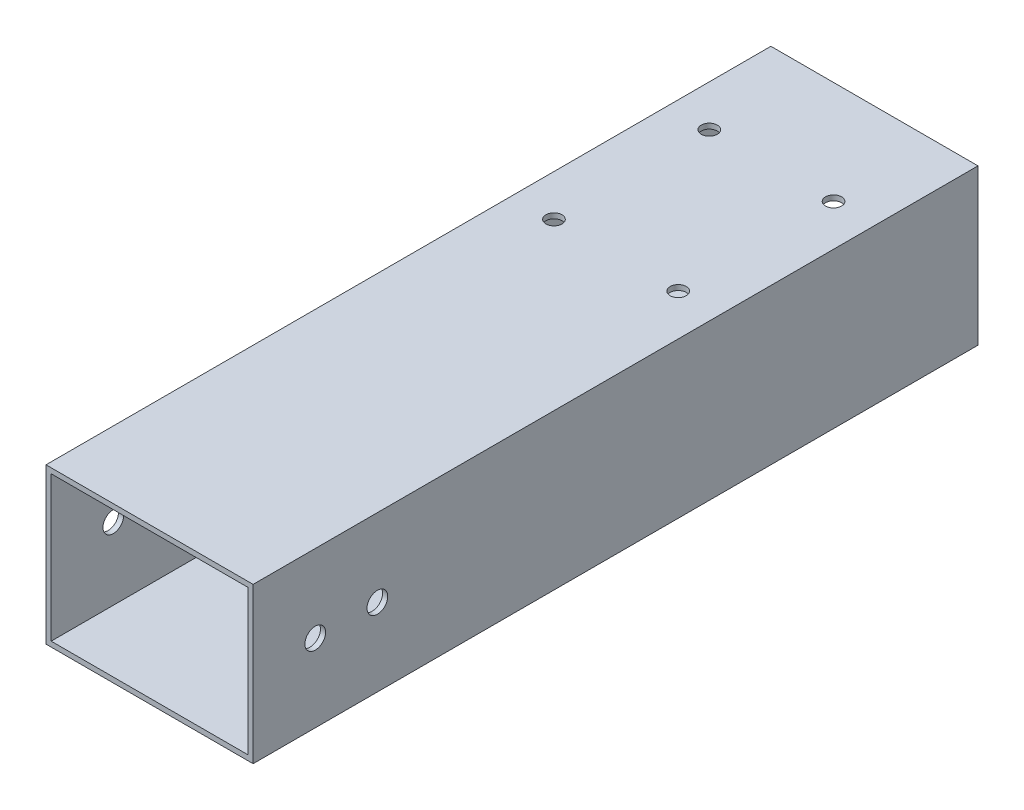
ISO-10303-21;
HEADER;
FILE_DESCRIPTION(('STEP AP214'),'2;1');
FILE_NAME('part.step','',(''),(''),'','','');
FILE_SCHEMA(('AUTOMOTIVE_DESIGN { 1 0 10303 214 1 1 1 1 }'));
ENDSEC;
DATA;
#1=APPLICATION_CONTEXT('core data for automotive mechanical design processes');
#2=APPLICATION_PROTOCOL_DEFINITION('international standard','automotive_design',2000,#1);
#3=PRODUCT_CONTEXT('',#1,'mechanical');
#4=PRODUCT('Part','Part','',(#3));
#5=PRODUCT_RELATED_PRODUCT_CATEGORY('part','',(#4));
#6=PRODUCT_DEFINITION_FORMATION('','',#4);
#7=PRODUCT_DEFINITION_CONTEXT('part definition',#1,'design');
#8=PRODUCT_DEFINITION('design','',#6,#7);
#9=PRODUCT_DEFINITION_SHAPE('','',#8);
#10=(LENGTH_UNIT() NAMED_UNIT(*) SI_UNIT(.MILLI.,.METRE.));
#11=(NAMED_UNIT(*) PLANE_ANGLE_UNIT() SI_UNIT($,.RADIAN.));
#12=(NAMED_UNIT(*) SI_UNIT($,.STERADIAN.) SOLID_ANGLE_UNIT());
#13=UNCERTAINTY_MEASURE_WITH_UNIT(LENGTH_MEASURE(1.E-05),#10,'distance_accuracy_value','');
#14=(GEOMETRIC_REPRESENTATION_CONTEXT(3) GLOBAL_UNCERTAINTY_ASSIGNED_CONTEXT((#13)) GLOBAL_UNIT_ASSIGNED_CONTEXT((#10,
#11,#12)) REPRESENTATION_CONTEXT('',''));
#15=CARTESIAN_POINT('',(0.,0.,0.));
#16=DIRECTION('',(0.,0.,1.));
#17=DIRECTION('',(1.,0.,0.));
#18=AXIS2_PLACEMENT_3D('',#15,#16,#17);
#19=CARTESIAN_POINT('',(0.,0.,140.));
#20=DIRECTION('',(0.,0.,-1.));
#21=DIRECTION('',(-1.,0.,0.));
#22=AXIS2_PLACEMENT_3D('',#19,#20,#21);
#23=PLANE('',#22);
#24=DIRECTION('',(0.,-1.,0.));
#25=VECTOR('',#24,1.);
#26=CARTESIAN_POINT('',(0.,0.,140.));
#27=LINE('',#26,#25);
#28=CARTESIAN_POINT('',(0.,30.,140.));
#29=VERTEX_POINT('',#28);
#30=CARTESIAN_POINT('',(0.,0.,140.));
#31=VERTEX_POINT('',#30);
#32=EDGE_CURVE('E158',#29,#31,#27,.T.);
#33=ORIENTED_EDGE('',*,*,#32,.T.);
#34=DIRECTION('',(1.,0.,0.));
#35=VECTOR('',#34,1.);
#36=CARTESIAN_POINT('',(0.,0.,140.));
#37=LINE('',#36,#35);
#38=CARTESIAN_POINT('',(40.,0.,140.));
#39=VERTEX_POINT('',#38);
#40=EDGE_CURVE('E162',#31,#39,#37,.T.);
#41=ORIENTED_EDGE('',*,*,#40,.T.);
#42=DIRECTION('',(0.,1.,0.));
#43=VECTOR('',#42,1.);
#44=CARTESIAN_POINT('',(40.,0.,140.));
#45=LINE('',#44,#43);
#46=CARTESIAN_POINT('',(40.,30.,140.));
#47=VERTEX_POINT('',#46);
#48=EDGE_CURVE('E166',#39,#47,#45,.T.);
#49=ORIENTED_EDGE('',*,*,#48,.T.);
#50=DIRECTION('',(-1.,0.,0.));
#51=VECTOR('',#50,1.);
#52=CARTESIAN_POINT('',(0.,30.,140.));
#53=LINE('',#52,#51);
#54=EDGE_CURVE('E169',#47,#29,#53,.T.);
#55=ORIENTED_EDGE('',*,*,#54,.T.);
#56=EDGE_LOOP('',(#33,#41,#49,#55));
#57=FACE_BOUND('',#56,.T.);
#58=DIRECTION('',(0.,-1.,0.));
#59=VECTOR('',#58,1.);
#60=CARTESIAN_POINT('',(1.,1.,140.));
#61=LINE('',#60,#59);
#62=CARTESIAN_POINT('',(1.,29.,140.));
#63=VERTEX_POINT('',#62);
#64=CARTESIAN_POINT('',(1.,1.,140.));
#65=VERTEX_POINT('',#64);
#66=EDGE_CURVE('E107',#63,#65,#61,.T.);
#67=ORIENTED_EDGE('',*,*,#66,.F.);
#68=DIRECTION('',(-1.,0.,0.));
#69=VECTOR('',#68,1.);
#70=CARTESIAN_POINT('',(1.,29.,140.));
#71=LINE('',#70,#69);
#72=CARTESIAN_POINT('',(39.,29.,140.));
#73=VERTEX_POINT('',#72);
#74=EDGE_CURVE('E135',#73,#63,#71,.T.);
#75=ORIENTED_EDGE('',*,*,#74,.F.);
#76=DIRECTION('',(0.,1.,0.));
#77=VECTOR('',#76,1.);
#78=CARTESIAN_POINT('',(39.,1.,140.));
#79=LINE('',#78,#77);
#80=CARTESIAN_POINT('',(39.,1.,140.));
#81=VERTEX_POINT('',#80);
#82=EDGE_CURVE('E129',#81,#73,#79,.T.);
#83=ORIENTED_EDGE('',*,*,#82,.F.);
#84=DIRECTION('',(1.,0.,0.));
#85=VECTOR('',#84,1.);
#86=CARTESIAN_POINT('',(1.,1.,140.));
#87=LINE('',#86,#85);
#88=EDGE_CURVE('E116',#65,#81,#87,.T.);
#89=ORIENTED_EDGE('',*,*,#88,.F.);
#90=EDGE_LOOP('',(#67,#75,#83,#89));
#91=FACE_BOUND('',#90,.T.);
#92=ADVANCED_FACE('F39',(#57,#91),#23,.F.);
#93=CARTESIAN_POINT('',(0.,0.,0.));
#94=DIRECTION('',(0.,0.,-1.));
#95=DIRECTION('',(-1.,0.,0.));
#96=AXIS2_PLACEMENT_3D('',#93,#94,#95);
#97=PLANE('',#96);
#98=DIRECTION('',(0.,-1.,0.));
#99=VECTOR('',#98,1.);
#100=CARTESIAN_POINT('',(0.,0.,0.));
#101=LINE('',#100,#99);
#102=CARTESIAN_POINT('',(0.,30.,0.));
#103=VERTEX_POINT('',#102);
#104=CARTESIAN_POINT('',(0.,0.,0.));
#105=VERTEX_POINT('',#104);
#106=EDGE_CURVE('E125',#103,#105,#101,.T.);
#107=ORIENTED_EDGE('',*,*,#106,.F.);
#108=DIRECTION('',(-1.,0.,0.));
#109=VECTOR('',#108,1.);
#110=CARTESIAN_POINT('',(0.,30.,0.));
#111=LINE('',#110,#109);
#112=CARTESIAN_POINT('',(40.,30.,0.));
#113=VERTEX_POINT('',#112);
#114=EDGE_CURVE('E163',#113,#103,#111,.T.);
#115=ORIENTED_EDGE('',*,*,#114,.F.);
#116=DIRECTION('',(0.,1.,0.));
#117=VECTOR('',#116,1.);
#118=CARTESIAN_POINT('',(40.,0.,0.));
#119=LINE('',#118,#117);
#120=CARTESIAN_POINT('',(40.,0.,0.));
#121=VERTEX_POINT('',#120);
#122=EDGE_CURVE('E179',#121,#113,#119,.T.);
#123=ORIENTED_EDGE('',*,*,#122,.F.);
#124=DIRECTION('',(1.,0.,0.));
#125=VECTOR('',#124,1.);
#126=CARTESIAN_POINT('',(0.,0.,0.));
#127=LINE('',#126,#125);
#128=EDGE_CURVE('E176',#105,#121,#127,.T.);
#129=ORIENTED_EDGE('',*,*,#128,.F.);
#130=EDGE_LOOP('',(#107,#115,#123,#129));
#131=FACE_BOUND('',#130,.T.);
#132=DIRECTION('',(-1.,0.,0.));
#133=VECTOR('',#132,1.);
#134=CARTESIAN_POINT('',(1.,29.,0.));
#135=LINE('',#134,#133);
#136=CARTESIAN_POINT('',(39.,29.,0.));
#137=VERTEX_POINT('',#136);
#138=CARTESIAN_POINT('',(1.,29.,0.));
#139=VERTEX_POINT('',#138);
#140=EDGE_CURVE('E117',#137,#139,#135,.T.);
#141=ORIENTED_EDGE('',*,*,#140,.T.);
#142=DIRECTION('',(0.,-1.,0.));
#143=VECTOR('',#142,1.);
#144=CARTESIAN_POINT('',(1.,1.,0.));
#145=LINE('',#144,#143);
#146=CARTESIAN_POINT('',(1.,1.,0.));
#147=VERTEX_POINT('',#146);
#148=EDGE_CURVE('E65',#139,#147,#145,.T.);
#149=ORIENTED_EDGE('',*,*,#148,.T.);
#150=DIRECTION('',(1.,0.,0.));
#151=VECTOR('',#150,1.);
#152=CARTESIAN_POINT('',(1.,1.,0.));
#153=LINE('',#152,#151);
#154=CARTESIAN_POINT('',(39.,1.,0.));
#155=VERTEX_POINT('',#154);
#156=EDGE_CURVE('E123',#147,#155,#153,.T.);
#157=ORIENTED_EDGE('',*,*,#156,.T.);
#158=DIRECTION('',(0.,1.,0.));
#159=VECTOR('',#158,1.);
#160=CARTESIAN_POINT('',(39.,1.,0.));
#161=LINE('',#160,#159);
#162=EDGE_CURVE('E145',#155,#137,#161,.T.);
#163=ORIENTED_EDGE('',*,*,#162,.T.);
#164=EDGE_LOOP('',(#141,#149,#157,#163));
#165=FACE_BOUND('',#164,.T.);
#166=ADVANCED_FACE('F271',(#131,#165),#97,.T.);
#167=CARTESIAN_POINT('',(0.,0.,140.));
#168=DIRECTION('',(1.,0.,0.));
#169=DIRECTION('',(0.,0.,-1.));
#170=AXIS2_PLACEMENT_3D('',#167,#168,#169);
#171=PLANE('',#170);
#172=CARTESIAN_POINT('',(0.,15.,116.));
#173=DIRECTION('',(1.,0.,0.));
#174=DIRECTION('',(0.,0.,-1.));
#175=AXIS2_PLACEMENT_3D('',#172,#173,#174);
#176=CIRCLE('',#175,2.);
#177=CARTESIAN_POINT('',(0.,15.,114.));
#178=VERTEX_POINT('',#177);
#179=EDGE_CURVE('E241',#178,#178,#176,.T.);
#180=ORIENTED_EDGE('',*,*,#179,.T.);
#181=EDGE_LOOP('',(#180));
#182=FACE_BOUND('',#181,.T.);
#183=CARTESIAN_POINT('',(0.,15.,128.));
#184=DIRECTION('',(1.,0.,0.));
#185=DIRECTION('',(0.,0.,-1.));
#186=AXIS2_PLACEMENT_3D('',#183,#184,#185);
#187=CIRCLE('',#186,2.);
#188=CARTESIAN_POINT('',(0.,15.,126.));
#189=VERTEX_POINT('',#188);
#190=EDGE_CURVE('E237',#189,#189,#187,.T.);
#191=ORIENTED_EDGE('',*,*,#190,.T.);
#192=EDGE_LOOP('',(#191));
#193=FACE_BOUND('',#192,.T.);
#194=ORIENTED_EDGE('',*,*,#106,.T.);
#195=DIRECTION('',(0.,0.,-1.));
#196=VECTOR('',#195,1.);
#197=CARTESIAN_POINT('',(0.,0.,140.));
#198=LINE('',#197,#196);
#199=EDGE_CURVE('E11',#31,#105,#198,.T.);
#200=ORIENTED_EDGE('',*,*,#199,.F.);
#201=ORIENTED_EDGE('',*,*,#32,.F.);
#202=DIRECTION('',(0.,0.,-1.));
#203=VECTOR('',#202,1.);
#204=CARTESIAN_POINT('',(0.,30.,140.));
#205=LINE('',#204,#203);
#206=EDGE_CURVE('E172',#29,#103,#205,.T.);
#207=ORIENTED_EDGE('',*,*,#206,.T.);
#208=EDGE_LOOP('',(#194,#200,#201,#207));
#209=FACE_BOUND('',#208,.T.);
#210=ADVANCED_FACE('F41',(#182,#193,#209),#171,.F.);
#211=CARTESIAN_POINT('',(0.,0.,140.));
#212=DIRECTION('',(0.,1.,0.));
#213=DIRECTION('',(0.,0.,1.));
#214=AXIS2_PLACEMENT_3D('',#211,#212,#213);
#215=PLANE('',#214);
#216=CARTESIAN_POINT('',(8.,0.,49.9));
#217=DIRECTION('',(0.,1.,0.));
#218=DIRECTION('',(0.,0.,-1.));
#219=AXIS2_PLACEMENT_3D('',#216,#217,#218);
#220=CIRCLE('',#219,1.55);
#221=CARTESIAN_POINT('',(8.,0.,48.35));
#222=VERTEX_POINT('',#221);
#223=EDGE_CURVE('E384',#222,#222,#220,.T.);
#224=ORIENTED_EDGE('',*,*,#223,.T.);
#225=EDGE_LOOP('',(#224));
#226=FACE_BOUND('',#225,.T.);
#227=CARTESIAN_POINT('',(32.,0.,49.9));
#228=DIRECTION('',(0.,1.,0.));
#229=DIRECTION('',(0.,0.,1.));
#230=AXIS2_PLACEMENT_3D('',#227,#228,#229);
#231=CIRCLE('',#230,1.55);
#232=CARTESIAN_POINT('',(32.,0.,51.45));
#233=VERTEX_POINT('',#232);
#234=EDGE_CURVE('E374',#233,#233,#231,.T.);
#235=ORIENTED_EDGE('',*,*,#234,.T.);
#236=EDGE_LOOP('',(#235));
#237=FACE_BOUND('',#236,.T.);
#238=CARTESIAN_POINT('',(32.,0.,19.9));
#239=DIRECTION('',(0.,1.,0.));
#240=DIRECTION('',(0.,0.,-1.));
#241=AXIS2_PLACEMENT_3D('',#238,#239,#240);
#242=CIRCLE('',#241,1.54999999999999);
#243=CARTESIAN_POINT('',(32.,0.,18.35));
#244=VERTEX_POINT('',#243);
#245=EDGE_CURVE('E363',#244,#244,#242,.T.);
#246=ORIENTED_EDGE('',*,*,#245,.T.);
#247=EDGE_LOOP('',(#246));
#248=FACE_BOUND('',#247,.T.);
#249=CARTESIAN_POINT('',(8.,0.,19.9));
#250=DIRECTION('',(0.,1.,0.));
#251=DIRECTION('',(0.,0.,1.));
#252=AXIS2_PLACEMENT_3D('',#249,#250,#251);
#253=CIRCLE('',#252,1.55);
#254=CARTESIAN_POINT('',(8.,0.,21.45));
#255=VERTEX_POINT('',#254);
#256=EDGE_CURVE('E371',#255,#255,#253,.T.);
#257=ORIENTED_EDGE('',*,*,#256,.T.);
#258=EDGE_LOOP('',(#257));
#259=FACE_BOUND('',#258,.T.);
#260=ORIENTED_EDGE('',*,*,#128,.T.);
#261=DIRECTION('',(0.,0.,-1.));
#262=VECTOR('',#261,1.);
#263=CARTESIAN_POINT('',(40.,0.,140.));
#264=LINE('',#263,#262);
#265=EDGE_CURVE('E49',#39,#121,#264,.T.);
#266=ORIENTED_EDGE('',*,*,#265,.F.);
#267=ORIENTED_EDGE('',*,*,#40,.F.);
#268=ORIENTED_EDGE('',*,*,#199,.T.);
#269=EDGE_LOOP('',(#260,#266,#267,#268));
#270=FACE_BOUND('',#269,.T.);
#271=ADVANCED_FACE('F270',(#226,#237,#248,#259,#270),#215,.F.);
#272=CARTESIAN_POINT('',(40.,0.,140.));
#273=DIRECTION('',(-1.,0.,0.));
#274=DIRECTION('',(0.,0.,1.));
#275=AXIS2_PLACEMENT_3D('',#272,#273,#274);
#276=PLANE('',#275);
#277=CARTESIAN_POINT('',(40.,15.,116.));
#278=DIRECTION('',(1.,0.,0.));
#279=DIRECTION('',(0.,0.,-1.));
#280=AXIS2_PLACEMENT_3D('',#277,#278,#279);
#281=CIRCLE('',#280,2.);
#282=CARTESIAN_POINT('',(40.,15.,114.));
#283=VERTEX_POINT('',#282);
#284=EDGE_CURVE('E199',#283,#283,#281,.T.);
#285=ORIENTED_EDGE('',*,*,#284,.F.);
#286=EDGE_LOOP('',(#285));
#287=FACE_BOUND('',#286,.T.);
#288=CARTESIAN_POINT('',(40.,15.,128.));
#289=DIRECTION('',(1.,0.,0.));
#290=DIRECTION('',(0.,0.,-1.));
#291=AXIS2_PLACEMENT_3D('',#288,#289,#290);
#292=CIRCLE('',#291,2.);
#293=CARTESIAN_POINT('',(40.,15.,126.));
#294=VERTEX_POINT('',#293);
#295=EDGE_CURVE('E245',#294,#294,#292,.T.);
#296=ORIENTED_EDGE('',*,*,#295,.F.);
#297=EDGE_LOOP('',(#296));
#298=FACE_BOUND('',#297,.T.);
#299=ORIENTED_EDGE('',*,*,#122,.T.);
#300=DIRECTION('',(0.,0.,-1.));
#301=VECTOR('',#300,1.);
#302=CARTESIAN_POINT('',(40.,30.,140.));
#303=LINE('',#302,#301);
#304=EDGE_CURVE('E187',#47,#113,#303,.T.);
#305=ORIENTED_EDGE('',*,*,#304,.F.);
#306=ORIENTED_EDGE('',*,*,#48,.F.);
#307=ORIENTED_EDGE('',*,*,#265,.T.);
#308=EDGE_LOOP('',(#299,#305,#306,#307));
#309=FACE_BOUND('',#308,.T.);
#310=ADVANCED_FACE('F291',(#287,#298,#309),#276,.F.);
#311=CARTESIAN_POINT('',(0.,30.,140.));
#312=DIRECTION('',(0.,-1.,0.));
#313=DIRECTION('',(0.,0.,-1.));
#314=AXIS2_PLACEMENT_3D('',#311,#312,#313);
#315=PLANE('',#314);
#316=CARTESIAN_POINT('',(8.,30.,49.9));
#317=DIRECTION('',(0.,1.,0.));
#318=DIRECTION('',(0.,0.,-1.));
#319=AXIS2_PLACEMENT_3D('',#316,#317,#318);
#320=CIRCLE('',#319,1.55);
#321=CARTESIAN_POINT('',(8.,30.,48.35));
#322=VERTEX_POINT('',#321);
#323=EDGE_CURVE('E380',#322,#322,#320,.T.);
#324=ORIENTED_EDGE('',*,*,#323,.F.);
#325=EDGE_LOOP('',(#324));
#326=FACE_BOUND('',#325,.T.);
#327=CARTESIAN_POINT('',(32.,30.,49.9));
#328=DIRECTION('',(0.,1.,0.));
#329=DIRECTION('',(0.,0.,1.));
#330=AXIS2_PLACEMENT_3D('',#327,#328,#329);
#331=CIRCLE('',#330,1.55);
#332=CARTESIAN_POINT('',(32.,30.,51.45));
#333=VERTEX_POINT('',#332);
#334=EDGE_CURVE('E367',#333,#333,#331,.T.);
#335=ORIENTED_EDGE('',*,*,#334,.F.);
#336=EDGE_LOOP('',(#335));
#337=FACE_BOUND('',#336,.T.);
#338=CARTESIAN_POINT('',(32.,30.,19.9));
#339=DIRECTION('',(0.,1.,0.));
#340=DIRECTION('',(0.,0.,-1.));
#341=AXIS2_PLACEMENT_3D('',#338,#339,#340);
#342=CIRCLE('',#341,1.54999999999999);
#343=CARTESIAN_POINT('',(32.,30.,18.35));
#344=VERTEX_POINT('',#343);
#345=EDGE_CURVE('E366',#344,#344,#342,.T.);
#346=ORIENTED_EDGE('',*,*,#345,.F.);
#347=EDGE_LOOP('',(#346));
#348=FACE_BOUND('',#347,.T.);
#349=CARTESIAN_POINT('',(8.,30.,19.9));
#350=DIRECTION('',(0.,1.,0.));
#351=DIRECTION('',(0.,0.,1.));
#352=AXIS2_PLACEMENT_3D('',#349,#350,#351);
#353=CIRCLE('',#352,1.55);
#354=CARTESIAN_POINT('',(8.,30.,21.45));
#355=VERTEX_POINT('',#354);
#356=EDGE_CURVE('E209',#355,#355,#353,.T.);
#357=ORIENTED_EDGE('',*,*,#356,.F.);
#358=EDGE_LOOP('',(#357));
#359=FACE_BOUND('',#358,.T.);
#360=ORIENTED_EDGE('',*,*,#114,.T.);
#361=ORIENTED_EDGE('',*,*,#206,.F.);
#362=ORIENTED_EDGE('',*,*,#54,.F.);
#363=ORIENTED_EDGE('',*,*,#304,.T.);
#364=EDGE_LOOP('',(#360,#361,#362,#363));
#365=FACE_BOUND('',#364,.T.);
#366=ADVANCED_FACE('F289',(#326,#337,#348,#359,#365),#315,.F.);
#367=CARTESIAN_POINT('',(1.,1.,140.));
#368=DIRECTION('',(1.,0.,0.));
#369=DIRECTION('',(0.,0.,-1.));
#370=AXIS2_PLACEMENT_3D('',#367,#368,#369);
#371=PLANE('',#370);
#372=CARTESIAN_POINT('',(1.,15.,116.));
#373=DIRECTION('',(1.,0.,0.));
#374=DIRECTION('',(0.,0.,-1.));
#375=AXIS2_PLACEMENT_3D('',#372,#373,#374);
#376=CIRCLE('',#375,2.);
#377=CARTESIAN_POINT('',(1.,15.,114.));
#378=VERTEX_POINT('',#377);
#379=EDGE_CURVE('E143',#378,#378,#376,.F.);
#380=ORIENTED_EDGE('',*,*,#379,.T.);
#381=EDGE_LOOP('',(#380));
#382=FACE_BOUND('',#381,.T.);
#383=CARTESIAN_POINT('',(1.,15.,128.));
#384=DIRECTION('',(1.,0.,0.));
#385=DIRECTION('',(0.,0.,-1.));
#386=AXIS2_PLACEMENT_3D('',#383,#384,#385);
#387=CIRCLE('',#386,2.);
#388=CARTESIAN_POINT('',(1.,15.,126.));
#389=VERTEX_POINT('',#388);
#390=EDGE_CURVE('E198',#389,#389,#387,.F.);
#391=ORIENTED_EDGE('',*,*,#390,.T.);
#392=EDGE_LOOP('',(#391));
#393=FACE_BOUND('',#392,.T.);
#394=ORIENTED_EDGE('',*,*,#148,.F.);
#395=DIRECTION('',(0.,0.,-1.));
#396=VECTOR('',#395,1.);
#397=CARTESIAN_POINT('',(1.,29.,140.));
#398=LINE('',#397,#396);
#399=EDGE_CURVE('E111',#63,#139,#398,.T.);
#400=ORIENTED_EDGE('',*,*,#399,.F.);
#401=ORIENTED_EDGE('',*,*,#66,.T.);
#402=DIRECTION('',(0.,0.,-1.));
#403=VECTOR('',#402,1.);
#404=CARTESIAN_POINT('',(1.,1.,140.));
#405=LINE('',#404,#403);
#406=EDGE_CURVE('E110',#65,#147,#405,.T.);
#407=ORIENTED_EDGE('',*,*,#406,.T.);
#408=EDGE_LOOP('',(#394,#400,#401,#407));
#409=FACE_BOUND('',#408,.T.);
#410=ADVANCED_FACE('F109',(#382,#393,#409),#371,.T.);
#411=CARTESIAN_POINT('',(1.,1.,140.));
#412=DIRECTION('',(0.,1.,0.));
#413=DIRECTION('',(0.,0.,1.));
#414=AXIS2_PLACEMENT_3D('',#411,#412,#413);
#415=PLANE('',#414);
#416=CARTESIAN_POINT('',(8.,1.,49.9));
#417=DIRECTION('',(0.,1.,0.));
#418=DIRECTION('',(0.,0.,1.));
#419=AXIS2_PLACEMENT_3D('',#416,#417,#418);
#420=CIRCLE('',#419,1.55);
#421=CARTESIAN_POINT('',(8.,1.,51.45));
#422=VERTEX_POINT('',#421);
#423=EDGE_CURVE('E233',#422,#422,#420,.F.);
#424=ORIENTED_EDGE('',*,*,#423,.T.);
#425=EDGE_LOOP('',(#424));
#426=FACE_BOUND('',#425,.T.);
#427=CARTESIAN_POINT('',(32.,1.,49.9));
#428=DIRECTION('',(0.,1.,0.));
#429=DIRECTION('',(0.,0.,1.));
#430=AXIS2_PLACEMENT_3D('',#427,#428,#429);
#431=CIRCLE('',#430,1.55);
#432=CARTESIAN_POINT('',(32.,1.,51.45));
#433=VERTEX_POINT('',#432);
#434=EDGE_CURVE('E217',#433,#433,#431,.F.);
#435=ORIENTED_EDGE('',*,*,#434,.T.);
#436=EDGE_LOOP('',(#435));
#437=FACE_BOUND('',#436,.T.);
#438=CARTESIAN_POINT('',(32.,1.,19.9));
#439=DIRECTION('',(0.,1.,0.));
#440=DIRECTION('',(0.,0.,1.));
#441=AXIS2_PLACEMENT_3D('',#438,#439,#440);
#442=CIRCLE('',#441,1.54999999999999);
#443=CARTESIAN_POINT('',(32.,1.,21.45));
#444=VERTEX_POINT('',#443);
#445=EDGE_CURVE('E213',#444,#444,#442,.F.);
#446=ORIENTED_EDGE('',*,*,#445,.T.);
#447=EDGE_LOOP('',(#446));
#448=FACE_BOUND('',#447,.T.);
#449=CARTESIAN_POINT('',(8.,1.,19.9));
#450=DIRECTION('',(0.,1.,0.));
#451=DIRECTION('',(0.,0.,1.));
#452=AXIS2_PLACEMENT_3D('',#449,#450,#451);
#453=CIRCLE('',#452,1.55);
#454=CARTESIAN_POINT('',(8.,1.,21.45));
#455=VERTEX_POINT('',#454);
#456=EDGE_CURVE('E208',#455,#455,#453,.F.);
#457=ORIENTED_EDGE('',*,*,#456,.T.);
#458=EDGE_LOOP('',(#457));
#459=FACE_BOUND('',#458,.T.);
#460=ORIENTED_EDGE('',*,*,#156,.F.);
#461=ORIENTED_EDGE('',*,*,#406,.F.);
#462=ORIENTED_EDGE('',*,*,#88,.T.);
#463=DIRECTION('',(0.,0.,-1.));
#464=VECTOR('',#463,1.);
#465=CARTESIAN_POINT('',(39.,1.,140.));
#466=LINE('',#465,#464);
#467=EDGE_CURVE('E126',#81,#155,#466,.T.);
#468=ORIENTED_EDGE('',*,*,#467,.T.);
#469=EDGE_LOOP('',(#460,#461,#462,#468));
#470=FACE_BOUND('',#469,.T.);
#471=ADVANCED_FACE('F120',(#426,#437,#448,#459,#470),#415,.T.);
#472=CARTESIAN_POINT('',(39.,1.,140.));
#473=DIRECTION('',(-1.,0.,0.));
#474=DIRECTION('',(0.,0.,1.));
#475=AXIS2_PLACEMENT_3D('',#472,#473,#474);
#476=PLANE('',#475);
#477=CARTESIAN_POINT('',(39.,15.,116.));
#478=DIRECTION('',(-1.,0.,0.));
#479=DIRECTION('',(0.,0.,1.));
#480=AXIS2_PLACEMENT_3D('',#477,#478,#479);
#481=CIRCLE('',#480,2.);
#482=CARTESIAN_POINT('',(39.,15.,118.));
#483=VERTEX_POINT('',#482);
#484=EDGE_CURVE('E200',#483,#483,#481,.F.);
#485=ORIENTED_EDGE('',*,*,#484,.T.);
#486=EDGE_LOOP('',(#485));
#487=FACE_BOUND('',#486,.T.);
#488=CARTESIAN_POINT('',(39.,15.,128.));
#489=DIRECTION('',(-1.,0.,0.));
#490=DIRECTION('',(0.,0.,1.));
#491=AXIS2_PLACEMENT_3D('',#488,#489,#490);
#492=CIRCLE('',#491,2.);
#493=CARTESIAN_POINT('',(39.,15.,130.));
#494=VERTEX_POINT('',#493);
#495=EDGE_CURVE('E194',#494,#494,#492,.F.);
#496=ORIENTED_EDGE('',*,*,#495,.T.);
#497=EDGE_LOOP('',(#496));
#498=FACE_BOUND('',#497,.T.);
#499=ORIENTED_EDGE('',*,*,#162,.F.);
#500=ORIENTED_EDGE('',*,*,#467,.F.);
#501=ORIENTED_EDGE('',*,*,#82,.T.);
#502=DIRECTION('',(0.,0.,-1.));
#503=VECTOR('',#502,1.);
#504=CARTESIAN_POINT('',(39.,29.,140.));
#505=LINE('',#504,#503);
#506=EDGE_CURVE('E57',#73,#137,#505,.T.);
#507=ORIENTED_EDGE('',*,*,#506,.T.);
#508=EDGE_LOOP('',(#499,#500,#501,#507));
#509=FACE_BOUND('',#508,.T.);
#510=ADVANCED_FACE('F315',(#487,#498,#509),#476,.T.);
#511=CARTESIAN_POINT('',(1.,29.,140.));
#512=DIRECTION('',(0.,-1.,0.));
#513=DIRECTION('',(0.,0.,-1.));
#514=AXIS2_PLACEMENT_3D('',#511,#512,#513);
#515=PLANE('',#514);
#516=CARTESIAN_POINT('',(8.,29.,49.9));
#517=DIRECTION('',(0.,-1.,0.));
#518=DIRECTION('',(0.,0.,-1.));
#519=AXIS2_PLACEMENT_3D('',#516,#517,#518);
#520=CIRCLE('',#519,1.55);
#521=CARTESIAN_POINT('',(8.,29.,48.35));
#522=VERTEX_POINT('',#521);
#523=EDGE_CURVE('E43',#522,#522,#520,.F.);
#524=ORIENTED_EDGE('',*,*,#523,.T.);
#525=EDGE_LOOP('',(#524));
#526=FACE_BOUND('',#525,.T.);
#527=CARTESIAN_POINT('',(32.,29.,49.9));
#528=DIRECTION('',(0.,-1.,0.));
#529=DIRECTION('',(0.,0.,-1.));
#530=AXIS2_PLACEMENT_3D('',#527,#528,#529);
#531=CIRCLE('',#530,1.55);
#532=CARTESIAN_POINT('',(32.,29.,48.35));
#533=VERTEX_POINT('',#532);
#534=EDGE_CURVE('E214',#533,#533,#531,.F.);
#535=ORIENTED_EDGE('',*,*,#534,.T.);
#536=EDGE_LOOP('',(#535));
#537=FACE_BOUND('',#536,.T.);
#538=CARTESIAN_POINT('',(32.,29.,19.9));
#539=DIRECTION('',(0.,-1.,0.));
#540=DIRECTION('',(0.,0.,-1.));
#541=AXIS2_PLACEMENT_3D('',#538,#539,#540);
#542=CIRCLE('',#541,1.54999999999999);
#543=CARTESIAN_POINT('',(32.,29.,18.35));
#544=VERTEX_POINT('',#543);
#545=EDGE_CURVE('E210',#544,#544,#542,.F.);
#546=ORIENTED_EDGE('',*,*,#545,.T.);
#547=EDGE_LOOP('',(#546));
#548=FACE_BOUND('',#547,.T.);
#549=CARTESIAN_POINT('',(8.,29.,19.9));
#550=DIRECTION('',(0.,-1.,0.));
#551=DIRECTION('',(0.,0.,-1.));
#552=AXIS2_PLACEMENT_3D('',#549,#550,#551);
#553=CIRCLE('',#552,1.55);
#554=CARTESIAN_POINT('',(8.,29.,18.35));
#555=VERTEX_POINT('',#554);
#556=EDGE_CURVE('E204',#555,#555,#553,.F.);
#557=ORIENTED_EDGE('',*,*,#556,.T.);
#558=EDGE_LOOP('',(#557));
#559=FACE_BOUND('',#558,.T.);
#560=ORIENTED_EDGE('',*,*,#140,.F.);
#561=ORIENTED_EDGE('',*,*,#506,.F.);
#562=ORIENTED_EDGE('',*,*,#74,.T.);
#563=ORIENTED_EDGE('',*,*,#399,.T.);
#564=EDGE_LOOP('',(#560,#561,#562,#563));
#565=FACE_BOUND('',#564,.T.);
#566=ADVANCED_FACE('F319',(#526,#537,#548,#559,#565),#515,.T.);
#567=CARTESIAN_POINT('',(40.,15.,128.));
#568=DIRECTION('',(-1.,0.,0.));
#569=DIRECTION('',(0.,0.,1.));
#570=AXIS2_PLACEMENT_3D('',#567,#568,#569);
#571=CYLINDRICAL_SURFACE('',#570,2.);
#572=ORIENTED_EDGE('',*,*,#495,.F.);
#573=EDGE_LOOP('',(#572));
#574=FACE_BOUND('',#573,.T.);
#575=ORIENTED_EDGE('',*,*,#295,.T.);
#576=EDGE_LOOP('',(#575));
#577=FACE_BOUND('',#576,.T.);
#578=ADVANCED_FACE('F323',(#574,#577),#571,.F.);
#579=CARTESIAN_POINT('',(40.,15.,116.));
#580=DIRECTION('',(-1.,0.,0.));
#581=DIRECTION('',(0.,0.,1.));
#582=AXIS2_PLACEMENT_3D('',#579,#580,#581);
#583=CYLINDRICAL_SURFACE('',#582,2.);
#584=ORIENTED_EDGE('',*,*,#484,.F.);
#585=EDGE_LOOP('',(#584));
#586=FACE_BOUND('',#585,.T.);
#587=ORIENTED_EDGE('',*,*,#284,.T.);
#588=EDGE_LOOP('',(#587));
#589=FACE_BOUND('',#588,.T.);
#590=ADVANCED_FACE('F265',(#586,#589),#583,.F.);
#591=ORIENTED_EDGE('',*,*,#390,.F.);
#592=EDGE_LOOP('',(#591));
#593=FACE_BOUND('',#592,.T.);
#594=ORIENTED_EDGE('',*,*,#190,.F.);
#595=EDGE_LOOP('',(#594));
#596=FACE_BOUND('',#595,.T.);
#597=ADVANCED_FACE('F263',(#593,#596),#571,.F.);
#598=ORIENTED_EDGE('',*,*,#379,.F.);
#599=EDGE_LOOP('',(#598));
#600=FACE_BOUND('',#599,.T.);
#601=ORIENTED_EDGE('',*,*,#179,.F.);
#602=EDGE_LOOP('',(#601));
#603=FACE_BOUND('',#602,.T.);
#604=ADVANCED_FACE('F259',(#600,#603),#583,.F.);
#605=CARTESIAN_POINT('',(8.,30.,19.9));
#606=DIRECTION('',(0.,-1.,0.));
#607=DIRECTION('',(0.,0.,-1.));
#608=AXIS2_PLACEMENT_3D('',#605,#606,#607);
#609=CYLINDRICAL_SURFACE('',#608,1.55);
#610=ORIENTED_EDGE('',*,*,#556,.F.);
#611=EDGE_LOOP('',(#610));
#612=FACE_BOUND('',#611,.T.);
#613=ORIENTED_EDGE('',*,*,#356,.T.);
#614=EDGE_LOOP('',(#613));
#615=FACE_BOUND('',#614,.T.);
#616=ADVANCED_FACE('F262',(#612,#615),#609,.F.);
#617=CARTESIAN_POINT('',(32.,30.,19.9));
#618=DIRECTION('',(0.,-1.,0.));
#619=DIRECTION('',(0.,0.,-1.));
#620=AXIS2_PLACEMENT_3D('',#617,#618,#619);
#621=CYLINDRICAL_SURFACE('',#620,1.54999999999999);
#622=ORIENTED_EDGE('',*,*,#545,.F.);
#623=EDGE_LOOP('',(#622));
#624=FACE_BOUND('',#623,.T.);
#625=ORIENTED_EDGE('',*,*,#345,.T.);
#626=EDGE_LOOP('',(#625));
#627=FACE_BOUND('',#626,.T.);
#628=ADVANCED_FACE('F332',(#624,#627),#621,.F.);
#629=CARTESIAN_POINT('',(32.,30.,49.9));
#630=DIRECTION('',(0.,-1.,0.));
#631=DIRECTION('',(0.,0.,-1.));
#632=AXIS2_PLACEMENT_3D('',#629,#630,#631);
#633=CYLINDRICAL_SURFACE('',#632,1.55);
#634=ORIENTED_EDGE('',*,*,#534,.F.);
#635=EDGE_LOOP('',(#634));
#636=FACE_BOUND('',#635,.T.);
#637=ORIENTED_EDGE('',*,*,#334,.T.);
#638=EDGE_LOOP('',(#637));
#639=FACE_BOUND('',#638,.T.);
#640=ADVANCED_FACE('F338',(#636,#639),#633,.F.);
#641=CARTESIAN_POINT('',(8.,30.,49.9));
#642=DIRECTION('',(0.,-1.,0.));
#643=DIRECTION('',(0.,0.,-1.));
#644=AXIS2_PLACEMENT_3D('',#641,#642,#643);
#645=CYLINDRICAL_SURFACE('',#644,1.55);
#646=ORIENTED_EDGE('',*,*,#523,.F.);
#647=EDGE_LOOP('',(#646));
#648=FACE_BOUND('',#647,.T.);
#649=ORIENTED_EDGE('',*,*,#323,.T.);
#650=EDGE_LOOP('',(#649));
#651=FACE_BOUND('',#650,.T.);
#652=ADVANCED_FACE('F335',(#648,#651),#645,.F.);
#653=ORIENTED_EDGE('',*,*,#456,.F.);
#654=EDGE_LOOP('',(#653));
#655=FACE_BOUND('',#654,.T.);
#656=ORIENTED_EDGE('',*,*,#256,.F.);
#657=EDGE_LOOP('',(#656));
#658=FACE_BOUND('',#657,.T.);
#659=ADVANCED_FACE('F334',(#655,#658),#609,.F.);
#660=ORIENTED_EDGE('',*,*,#445,.F.);
#661=EDGE_LOOP('',(#660));
#662=FACE_BOUND('',#661,.T.);
#663=ORIENTED_EDGE('',*,*,#245,.F.);
#664=EDGE_LOOP('',(#663));
#665=FACE_BOUND('',#664,.T.);
#666=ADVANCED_FACE('F347',(#662,#665),#621,.F.);
#667=ORIENTED_EDGE('',*,*,#434,.F.);
#668=EDGE_LOOP('',(#667));
#669=FACE_BOUND('',#668,.T.);
#670=ORIENTED_EDGE('',*,*,#234,.F.);
#671=EDGE_LOOP('',(#670));
#672=FACE_BOUND('',#671,.T.);
#673=ADVANCED_FACE('F344',(#669,#672),#633,.F.);
#674=ORIENTED_EDGE('',*,*,#423,.F.);
#675=EDGE_LOOP('',(#674));
#676=FACE_BOUND('',#675,.T.);
#677=ORIENTED_EDGE('',*,*,#223,.F.);
#678=EDGE_LOOP('',(#677));
#679=FACE_BOUND('',#678,.T.);
#680=ADVANCED_FACE('F340',(#676,#679),#645,.F.);
#681=CLOSED_SHELL('',(#92,#166,#210,#271,#310,#366,#410,#471,#510,#566,#578,#590,#597,#604,#616,
#628,#640,#652,#659,#666,#673,#680));
#682=MANIFOLD_SOLID_BREP('B2',#681);
#683=ADVANCED_BREP_SHAPE_REPRESENTATION('',(#18,#682),#14);
#684=SHAPE_DEFINITION_REPRESENTATION(#9,#683);
ENDSEC;
END-ISO-10303-21;
